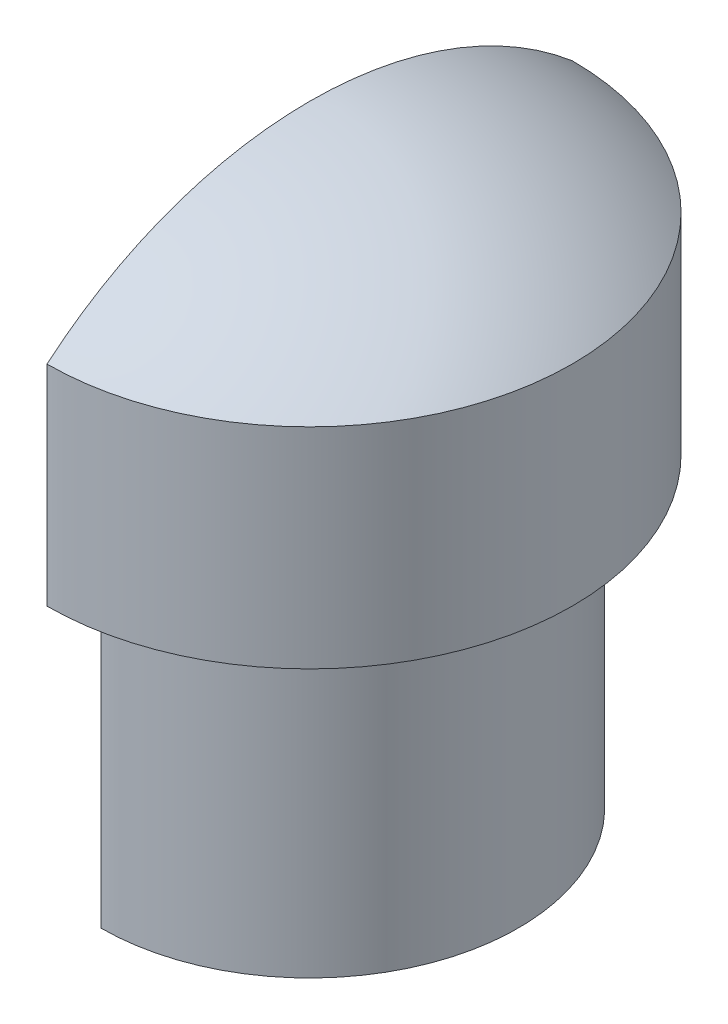
ISO-10303-21;
HEADER;
FILE_DESCRIPTION(('STEP AP214'),'2;1');
FILE_NAME('part.step','',(''),(''),'','','');
FILE_SCHEMA(('AUTOMOTIVE_DESIGN { 1 0 10303 214 1 1 1 1 }'));
ENDSEC;
DATA;
#1=APPLICATION_CONTEXT('core data for automotive mechanical design processes');
#2=APPLICATION_PROTOCOL_DEFINITION('international standard','automotive_design',2000,#1);
#3=PRODUCT_CONTEXT('',#1,'mechanical');
#4=PRODUCT('Part','Part','',(#3));
#5=PRODUCT_RELATED_PRODUCT_CATEGORY('part','',(#4));
#6=PRODUCT_DEFINITION_FORMATION('','',#4);
#7=PRODUCT_DEFINITION_CONTEXT('part definition',#1,'design');
#8=PRODUCT_DEFINITION('design','',#6,#7);
#9=PRODUCT_DEFINITION_SHAPE('','',#8);
#10=(LENGTH_UNIT() NAMED_UNIT(*) SI_UNIT(.MILLI.,.METRE.));
#11=(NAMED_UNIT(*) PLANE_ANGLE_UNIT() SI_UNIT($,.RADIAN.));
#12=(NAMED_UNIT(*) SI_UNIT($,.STERADIAN.) SOLID_ANGLE_UNIT());
#13=UNCERTAINTY_MEASURE_WITH_UNIT(LENGTH_MEASURE(1.E-05),#10,'distance_accuracy_value','');
#14=(GEOMETRIC_REPRESENTATION_CONTEXT(3) GLOBAL_UNCERTAINTY_ASSIGNED_CONTEXT((#13)) GLOBAL_UNIT_ASSIGNED_CONTEXT((#10,
#11,#12)) REPRESENTATION_CONTEXT('',''));
#15=CARTESIAN_POINT('',(0.,0.,0.));
#16=DIRECTION('',(0.,0.,1.));
#17=DIRECTION('',(1.,0.,0.));
#18=AXIS2_PLACEMENT_3D('',#15,#16,#17);
#19=CARTESIAN_POINT('',(0.,5.,0.));
#20=DIRECTION('',(0.,-1.,0.));
#21=DIRECTION('',(0.,0.,-1.));
#22=AXIS2_PLACEMENT_3D('',#19,#20,#21);
#23=CYLINDRICAL_SURFACE('',#22,2.9);
#24=DIRECTION('',(0.,-1.,0.));
#25=VECTOR('',#24,1.);
#26=CARTESIAN_POINT('',(0.,5.,-2.9));
#27=LINE('',#26,#25);
#28=CARTESIAN_POINT('',(0.,0.,-2.9));
#29=VERTEX_POINT('',#28);
#30=CARTESIAN_POINT('',(0.,4.25,-2.9));
#31=VERTEX_POINT('',#30);
#32=EDGE_CURVE('E110',#29,#31,#27,.F.);
#33=ORIENTED_EDGE('',*,*,#32,.T.);
#34=CARTESIAN_POINT('',(0.,4.25,0.));
#35=DIRECTION('',(0.,-1.,0.));
#36=DIRECTION('',(1.,0.,0.));
#37=AXIS2_PLACEMENT_3D('',#34,#35,#36);
#38=CIRCLE('',#37,2.9);
#39=CARTESIAN_POINT('',(0.,4.25,2.9));
#40=VERTEX_POINT('',#39);
#41=EDGE_CURVE('E138',#31,#40,#38,.T.);
#42=ORIENTED_EDGE('',*,*,#41,.T.);
#43=DIRECTION('',(0.,-1.,0.));
#44=VECTOR('',#43,1.);
#45=CARTESIAN_POINT('',(0.,5.,2.9));
#46=LINE('',#45,#44);
#47=CARTESIAN_POINT('',(0.,0.,2.9));
#48=VERTEX_POINT('',#47);
#49=EDGE_CURVE('E180',#40,#48,#46,.T.);
#50=ORIENTED_EDGE('',*,*,#49,.T.);
#51=CARTESIAN_POINT('',(0.,0.,0.));
#52=DIRECTION('',(0.,1.,0.));
#53=DIRECTION('',(0.,0.,1.));
#54=AXIS2_PLACEMENT_3D('',#51,#52,#53);
#55=CIRCLE('',#54,2.9);
#56=EDGE_CURVE('E11',#48,#29,#55,.T.);
#57=ORIENTED_EDGE('',*,*,#56,.T.);
#58=EDGE_LOOP('',(#33,#42,#50,#57));
#59=FACE_BOUND('',#58,.T.);
#60=ADVANCED_FACE('F45',(#59),#23,.T.);
#61=CARTESIAN_POINT('',(0.,5.,0.));
#62=DIRECTION('',(0.,1.,0.));
#63=DIRECTION('',(0.,0.,1.));
#64=AXIS2_PLACEMENT_3D('',#61,#62,#63);
#65=PLANE('',#64);
#66=CARTESIAN_POINT('',(0.,5.,0.));
#67=DIRECTION('',(0.,1.,0.));
#68=DIRECTION('',(0.,0.,1.));
#69=AXIS2_PLACEMENT_3D('',#66,#67,#68);
#70=CIRCLE('',#69,2.9);
#71=CARTESIAN_POINT('',(0.,5.,-2.9));
#72=VERTEX_POINT('',#71);
#73=CARTESIAN_POINT('',(0.,5.,2.9));
#74=VERTEX_POINT('',#73);
#75=EDGE_CURVE('E132',#72,#74,#70,.F.);
#76=ORIENTED_EDGE('',*,*,#75,.F.);
#77=DIRECTION('',(0.,0.,-1.));
#78=VECTOR('',#77,1.);
#79=CARTESIAN_POINT('',(0.,5.,-3.65));
#80=LINE('',#79,#78);
#81=CARTESIAN_POINT('',(0.,5.,-1.4));
#82=VERTEX_POINT('',#81);
#83=EDGE_CURVE('E154',#82,#72,#80,.T.);
#84=ORIENTED_EDGE('',*,*,#83,.F.);
#85=CARTESIAN_POINT('',(0.,5.,0.));
#86=DIRECTION('',(0.,1.,0.));
#87=DIRECTION('',(0.,0.,1.));
#88=AXIS2_PLACEMENT_3D('',#85,#86,#87);
#89=CIRCLE('',#88,1.4);
#90=CARTESIAN_POINT('',(0.,5.,1.4));
#91=VERTEX_POINT('',#90);
#92=EDGE_CURVE('E124',#91,#82,#89,.T.);
#93=ORIENTED_EDGE('',*,*,#92,.F.);
#94=EDGE_CURVE('E158',#74,#91,#80,.T.);
#95=ORIENTED_EDGE('',*,*,#94,.F.);
#96=EDGE_LOOP('',(#76,#84,#93,#95));
#97=FACE_BOUND('',#96,.T.);
#98=ADVANCED_FACE('F188',(#97),#65,.T.);
#99=CARTESIAN_POINT('',(0.,0.,0.));
#100=DIRECTION('',(0.,1.,0.));
#101=DIRECTION('',(0.,0.,1.));
#102=AXIS2_PLACEMENT_3D('',#99,#100,#101);
#103=PLANE('',#102);
#104=DIRECTION('',(0.,0.,-1.));
#105=VECTOR('',#104,1.);
#106=CARTESIAN_POINT('',(0.,0.,-3.65));
#107=LINE('',#106,#105);
#108=CARTESIAN_POINT('',(0.,0.,-1.4));
#109=VERTEX_POINT('',#108);
#110=EDGE_CURVE('E107',#109,#29,#107,.T.);
#111=ORIENTED_EDGE('',*,*,#110,.T.);
#112=ORIENTED_EDGE('',*,*,#56,.F.);
#113=CARTESIAN_POINT('',(0.,0.,1.4));
#114=VERTEX_POINT('',#113);
#115=EDGE_CURVE('E115',#48,#114,#107,.T.);
#116=ORIENTED_EDGE('',*,*,#115,.T.);
#117=CARTESIAN_POINT('',(0.,0.,0.));
#118=DIRECTION('',(0.,1.,0.));
#119=DIRECTION('',(0.,0.,1.));
#120=AXIS2_PLACEMENT_3D('',#117,#118,#119);
#121=CIRCLE('',#120,1.4);
#122=EDGE_CURVE('E53',#109,#114,#121,.F.);
#123=ORIENTED_EDGE('',*,*,#122,.F.);
#124=EDGE_LOOP('',(#111,#112,#116,#123));
#125=FACE_BOUND('',#124,.T.);
#126=ADVANCED_FACE('F129',(#125),#103,.F.);
#127=CARTESIAN_POINT('',(0.,-0.00100000000000013,0.));
#128=DIRECTION('',(0.,1.,0.));
#129=DIRECTION('',(0.,0.,1.));
#130=AXIS2_PLACEMENT_3D('',#127,#128,#129);
#131=CYLINDRICAL_SURFACE('',#130,1.4);
#132=DIRECTION('',(0.,1.,0.));
#133=VECTOR('',#132,1.);
#134=CARTESIAN_POINT('',(0.,-0.00100000000000013,1.4));
#135=LINE('',#134,#133);
#136=EDGE_CURVE('E126',#114,#91,#135,.T.);
#137=ORIENTED_EDGE('',*,*,#136,.T.);
#138=ORIENTED_EDGE('',*,*,#92,.T.);
#139=DIRECTION('',(0.,1.,0.));
#140=VECTOR('',#139,1.);
#141=CARTESIAN_POINT('',(0.,-0.00100000000000013,-1.4));
#142=LINE('',#141,#140);
#143=EDGE_CURVE('E67',#82,#109,#142,.F.);
#144=ORIENTED_EDGE('',*,*,#143,.T.);
#145=ORIENTED_EDGE('',*,*,#122,.T.);
#146=EDGE_LOOP('',(#137,#138,#144,#145));
#147=FACE_BOUND('',#146,.T.);
#148=ADVANCED_FACE('F122',(#147),#131,.F.);
#149=CARTESIAN_POINT('',(0.,2.84868421052631,0.));
#150=DIRECTION('',(0.,-1.,0.));
#151=DIRECTION('',(1.,0.,0.));
#152=AXIS2_PLACEMENT_3D('',#149,#150,#151);
#153=SPHERICAL_SURFACE('',#152,4.90131578947369);
#154=CARTESIAN_POINT('',(0.,6.8,0.));
#155=DIRECTION('',(0.,-1.,0.));
#156=DIRECTION('',(1.,0.,0.));
#157=AXIS2_PLACEMENT_3D('',#154,#155,#156);
#158=CIRCLE('',#157,2.9);
#159=CARTESIAN_POINT('',(0.,6.8,-2.9));
#160=VERTEX_POINT('',#159);
#161=CARTESIAN_POINT('',(0.,6.8,2.9));
#162=VERTEX_POINT('',#161);
#163=EDGE_CURVE('E142',#160,#162,#158,.T.);
#164=ORIENTED_EDGE('',*,*,#163,.T.);
#165=CARTESIAN_POINT('',(0.,2.84868421052631,0.));
#166=DIRECTION('',(-1.,0.,0.));
#167=DIRECTION('',(0.,0.,1.));
#168=AXIS2_PLACEMENT_3D('',#165,#166,#167);
#169=CIRCLE('',#168,4.90131578947369);
#170=EDGE_CURVE('E161',#160,#162,#169,.F.);
#171=ORIENTED_EDGE('',*,*,#170,.F.);
#172=EDGE_LOOP('',(#164,#171));
#173=FACE_BOUND('',#172,.T.);
#174=ADVANCED_FACE('F226',(#173),#153,.F.);
#175=CARTESIAN_POINT('',(0.,5.,0.));
#176=DIRECTION('',(0.,-1.,0.));
#177=DIRECTION('',(1.,0.,0.));
#178=AXIS2_PLACEMENT_3D('',#175,#176,#177);
#179=CYLINDRICAL_SURFACE('',#178,2.9);
#180=ORIENTED_EDGE('',*,*,#163,.F.);
#181=DIRECTION('',(0.,-1.,0.));
#182=VECTOR('',#181,1.);
#183=CARTESIAN_POINT('',(0.,5.,-2.9));
#184=LINE('',#183,#182);
#185=EDGE_CURVE('E155',#72,#160,#184,.F.);
#186=ORIENTED_EDGE('',*,*,#185,.F.);
#187=ORIENTED_EDGE('',*,*,#75,.T.);
#188=DIRECTION('',(0.,-1.,0.));
#189=VECTOR('',#188,1.);
#190=CARTESIAN_POINT('',(0.,5.,2.9));
#191=LINE('',#190,#189);
#192=EDGE_CURVE('E164',#162,#74,#191,.T.);
#193=ORIENTED_EDGE('',*,*,#192,.F.);
#194=EDGE_LOOP('',(#180,#186,#187,#193));
#195=FACE_BOUND('',#194,.T.);
#196=ADVANCED_FACE('F213',(#195),#179,.F.);
#197=CARTESIAN_POINT('',(3.65,4.25,0.));
#198=DIRECTION('',(0.,-1.,0.));
#199=DIRECTION('',(1.,0.,0.));
#200=AXIS2_PLACEMENT_3D('',#197,#198,#199);
#201=PLANE('',#200);
#202=CARTESIAN_POINT('',(0.,4.25,0.));
#203=DIRECTION('',(0.,-1.,0.));
#204=DIRECTION('',(1.,0.,0.));
#205=AXIS2_PLACEMENT_3D('',#202,#203,#204);
#206=CIRCLE('',#205,3.65);
#207=CARTESIAN_POINT('',(0.,4.25,-3.65));
#208=VERTEX_POINT('',#207);
#209=CARTESIAN_POINT('',(0.,4.25,3.65));
#210=VERTEX_POINT('',#209);
#211=EDGE_CURVE('E150',#208,#210,#206,.T.);
#212=ORIENTED_EDGE('',*,*,#211,.T.);
#213=DIRECTION('',(0.,0.,1.));
#214=VECTOR('',#213,1.);
#215=CARTESIAN_POINT('',(0.,4.25,-3.65));
#216=LINE('',#215,#214);
#217=EDGE_CURVE('E60',#40,#210,#216,.T.);
#218=ORIENTED_EDGE('',*,*,#217,.F.);
#219=ORIENTED_EDGE('',*,*,#41,.F.);
#220=EDGE_CURVE('E116',#208,#31,#216,.T.);
#221=ORIENTED_EDGE('',*,*,#220,.F.);
#222=EDGE_LOOP('',(#212,#218,#219,#221));
#223=FACE_BOUND('',#222,.T.);
#224=ADVANCED_FACE('F199',(#223),#201,.T.);
#225=CARTESIAN_POINT('',(0.,2.84868421052631,0.));
#226=DIRECTION('',(0.,-1.,0.));
#227=DIRECTION('',(1.,0.,0.));
#228=AXIS2_PLACEMENT_3D('',#225,#226,#227);
#229=SPHERICAL_SURFACE('',#228,5.65131578947369);
#230=CARTESIAN_POINT('',(0.,7.16317956367651,0.));
#231=DIRECTION('',(0.,-1.,0.));
#232=DIRECTION('',(1.,0.,0.));
#233=AXIS2_PLACEMENT_3D('',#230,#231,#232);
#234=CIRCLE('',#233,3.65);
#235=CARTESIAN_POINT('',(0.,7.16317956367651,-3.65));
#236=VERTEX_POINT('',#235);
#237=CARTESIAN_POINT('',(0.,7.16317956367651,3.65));
#238=VERTEX_POINT('',#237);
#239=EDGE_CURVE('E146',#236,#238,#234,.T.);
#240=ORIENTED_EDGE('',*,*,#239,.F.);
#241=CARTESIAN_POINT('',(0.,2.84868421052631,0.));
#242=DIRECTION('',(-1.,0.,0.));
#243=DIRECTION('',(0.,0.,1.));
#244=AXIS2_PLACEMENT_3D('',#241,#242,#243);
#245=CIRCLE('',#244,5.65131578947369);
#246=EDGE_CURVE('E172',#238,#236,#245,.T.);
#247=ORIENTED_EDGE('',*,*,#246,.F.);
#248=EDGE_LOOP('',(#240,#247));
#249=FACE_BOUND('',#248,.T.);
#250=ADVANCED_FACE('F205',(#249),#229,.T.);
#251=CARTESIAN_POINT('',(0.,5.,0.));
#252=DIRECTION('',(0.,-1.,0.));
#253=DIRECTION('',(1.,0.,0.));
#254=AXIS2_PLACEMENT_3D('',#251,#252,#253);
#255=CYLINDRICAL_SURFACE('',#254,3.65);
#256=ORIENTED_EDGE('',*,*,#211,.F.);
#257=DIRECTION('',(0.,-1.,0.));
#258=VECTOR('',#257,1.);
#259=CARTESIAN_POINT('',(0.,5.,-3.65));
#260=LINE('',#259,#258);
#261=EDGE_CURVE('E175',#236,#208,#260,.T.);
#262=ORIENTED_EDGE('',*,*,#261,.F.);
#263=ORIENTED_EDGE('',*,*,#239,.T.);
#264=DIRECTION('',(0.,-1.,0.));
#265=VECTOR('',#264,1.);
#266=CARTESIAN_POINT('',(0.,8.501,3.65));
#267=LINE('',#266,#265);
#268=EDGE_CURVE('E167',#238,#210,#267,.T.);
#269=ORIENTED_EDGE('',*,*,#268,.T.);
#270=EDGE_LOOP('',(#256,#262,#263,#269));
#271=FACE_BOUND('',#270,.T.);
#272=ADVANCED_FACE('F201',(#271),#255,.T.);
#273=CARTESIAN_POINT('',(0.,8.501,-3.65));
#274=DIRECTION('',(-1.,0.,0.));
#275=DIRECTION('',(0.,0.,1.));
#276=AXIS2_PLACEMENT_3D('',#273,#274,#275);
#277=PLANE('',#276);
#278=ORIENTED_EDGE('',*,*,#83,.T.);
#279=ORIENTED_EDGE('',*,*,#185,.T.);
#280=ORIENTED_EDGE('',*,*,#170,.T.);
#281=ORIENTED_EDGE('',*,*,#192,.T.);
#282=ORIENTED_EDGE('',*,*,#94,.T.);
#283=ORIENTED_EDGE('',*,*,#136,.F.);
#284=ORIENTED_EDGE('',*,*,#115,.F.);
#285=ORIENTED_EDGE('',*,*,#49,.F.);
#286=ORIENTED_EDGE('',*,*,#217,.T.);
#287=ORIENTED_EDGE('',*,*,#268,.F.);
#288=ORIENTED_EDGE('',*,*,#246,.T.);
#289=ORIENTED_EDGE('',*,*,#261,.T.);
#290=ORIENTED_EDGE('',*,*,#220,.T.);
#291=ORIENTED_EDGE('',*,*,#32,.F.);
#292=ORIENTED_EDGE('',*,*,#110,.F.);
#293=ORIENTED_EDGE('',*,*,#143,.F.);
#294=EDGE_LOOP('',(#278,#279,#280,#281,#282,#283,#284,#285,#286,#287,#288,#289,#290,#291,#292,#293));
#295=FACE_BOUND('',#294,.T.);
#296=ADVANCED_FACE('F108',(#295),#277,.T.);
#297=CLOSED_SHELL('',(#60,#98,#126,#148,#174,#196,#224,#250,#272,#296));
#298=MANIFOLD_SOLID_BREP('B2',#297);
#299=ADVANCED_BREP_SHAPE_REPRESENTATION('',(#18,#298),#14);
#300=SHAPE_DEFINITION_REPRESENTATION(#9,#299);
ENDSEC;
END-ISO-10303-21;
